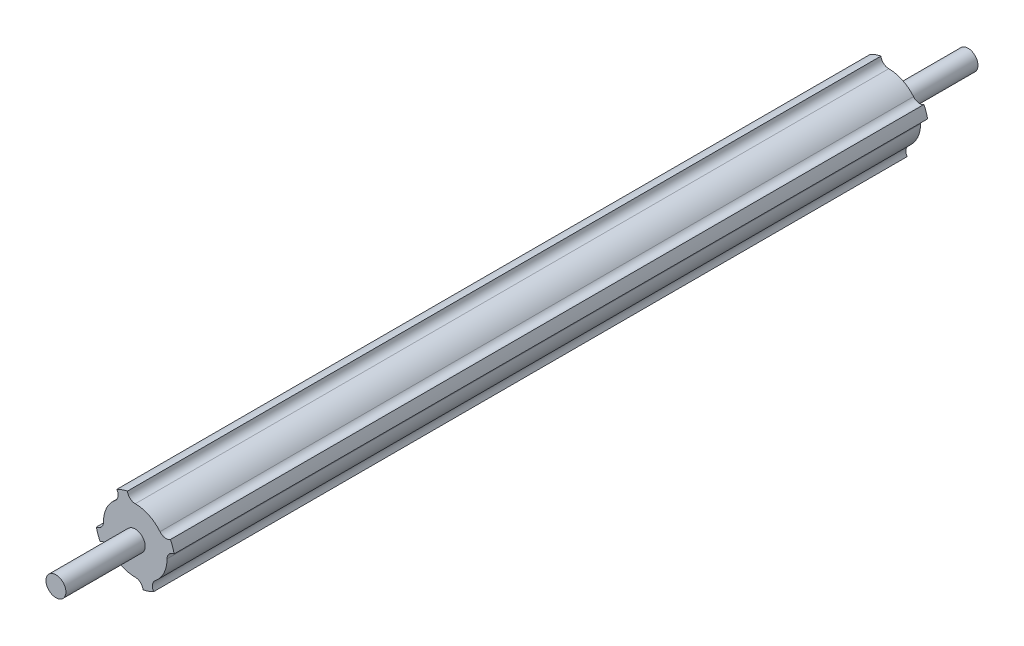
ISO-10303-21;
HEADER;
FILE_DESCRIPTION(('STEP AP214'),'2;1');
FILE_NAME('part.step','',(''),(''),'','','');
FILE_SCHEMA(('AUTOMOTIVE_DESIGN { 1 0 10303 214 1 1 1 1 }'));
ENDSEC;
DATA;
#1=APPLICATION_CONTEXT('core data for automotive mechanical design processes');
#2=APPLICATION_PROTOCOL_DEFINITION('international standard','automotive_design',2000,#1);
#3=PRODUCT_CONTEXT('',#1,'mechanical');
#4=PRODUCT('Part','Part','',(#3));
#5=PRODUCT_RELATED_PRODUCT_CATEGORY('part','',(#4));
#6=PRODUCT_DEFINITION_FORMATION('','',#4);
#7=PRODUCT_DEFINITION_CONTEXT('part definition',#1,'design');
#8=PRODUCT_DEFINITION('design','',#6,#7);
#9=PRODUCT_DEFINITION_SHAPE('','',#8);
#10=(LENGTH_UNIT() NAMED_UNIT(*) SI_UNIT(.MILLI.,.METRE.));
#11=(NAMED_UNIT(*) PLANE_ANGLE_UNIT() SI_UNIT($,.RADIAN.));
#12=(NAMED_UNIT(*) SI_UNIT($,.STERADIAN.) SOLID_ANGLE_UNIT());
#13=UNCERTAINTY_MEASURE_WITH_UNIT(LENGTH_MEASURE(1.E-05),#10,'distance_accuracy_value','');
#14=(GEOMETRIC_REPRESENTATION_CONTEXT(3) GLOBAL_UNCERTAINTY_ASSIGNED_CONTEXT((#13)) GLOBAL_UNIT_ASSIGNED_CONTEXT((#10,
#11,#12)) REPRESENTATION_CONTEXT('',''));
#15=CARTESIAN_POINT('',(0.,0.,0.));
#16=DIRECTION('',(0.,0.,1.));
#17=DIRECTION('',(1.,0.,0.));
#18=AXIS2_PLACEMENT_3D('',#15,#16,#17);
#19=CARTESIAN_POINT('',(0.,0.,584.2));
#20=DIRECTION('',(0.,0.,-1.));
#21=DIRECTION('',(-1.,0.,0.));
#22=AXIS2_PLACEMENT_3D('',#19,#20,#21);
#23=CYLINDRICAL_SURFACE('',#22,25.4);
#24=CARTESIAN_POINT('',(0.,0.,50.8));
#25=DIRECTION('',(0.,0.,1.));
#26=DIRECTION('',(1.,0.,0.));
#27=AXIS2_PLACEMENT_3D('',#24,#25,#26);
#28=CIRCLE('',#27,25.4);
#29=CARTESIAN_POINT('',(-4.99077597716393,24.9048620784329,50.8));
#30=VERTEX_POINT('',#29);
#31=CARTESIAN_POINT('',(-11.781548987493,22.5023355111265,50.8));
#32=VERTEX_POINT('',#31);
#33=EDGE_CURVE('E266',#30,#32,#28,.T.);
#34=ORIENTED_EDGE('',*,*,#33,.T.);
#35=DIRECTION('',(0.,0.,1.));
#36=VECTOR('',#35,1.);
#37=CARTESIAN_POINT('',(-11.781548987493,22.5023355111265,292.1));
#38=LINE('',#37,#36);
#39=CARTESIAN_POINT('',(-11.781548987493,22.5023355111265,533.4));
#40=VERTEX_POINT('',#39);
#41=EDGE_CURVE('E174',#32,#40,#38,.T.);
#42=ORIENTED_EDGE('',*,*,#41,.T.);
#43=CARTESIAN_POINT('',(0.,0.,533.4));
#44=DIRECTION('',(0.,0.,1.));
#45=DIRECTION('',(1.,0.,0.));
#46=AXIS2_PLACEMENT_3D('',#43,#44,#45);
#47=CIRCLE('',#46,25.4);
#48=CARTESIAN_POINT('',(-4.99077597716394,24.9048620784329,533.4));
#49=VERTEX_POINT('',#48);
#50=EDGE_CURVE('E265',#49,#40,#47,.T.);
#51=ORIENTED_EDGE('',*,*,#50,.F.);
#52=DIRECTION('',(0.,0.,1.));
#53=VECTOR('',#52,1.);
#54=CARTESIAN_POINT('',(-4.99077597716393,24.9048620784329,316.230000000001));
#55=LINE('',#54,#53);
#56=EDGE_CURVE('E234',#49,#30,#55,.F.);
#57=ORIENTED_EDGE('',*,*,#56,.T.);
#58=EDGE_LOOP('',(#34,#42,#51,#57));
#59=FACE_BOUND('',#58,.T.);
#60=ADVANCED_FACE('F51',(#59),#23,.T.);
#61=CARTESIAN_POINT('',(-24.9048620784329,-4.99077597716368,533.4));
#62=VERTEX_POINT('',#61);
#63=CARTESIAN_POINT('',(-22.5023355111263,-11.7815489874932,533.4));
#64=VERTEX_POINT('',#63);
#65=EDGE_CURVE('E272',#62,#64,#47,.T.);
#66=ORIENTED_EDGE('',*,*,#65,.F.);
#67=DIRECTION('',(0.,0.,1.));
#68=VECTOR('',#67,1.);
#69=CARTESIAN_POINT('',(-24.9048620784329,-4.99077597716367,292.1));
#70=LINE('',#69,#68);
#71=CARTESIAN_POINT('',(-24.9048620784329,-4.99077597716367,50.8));
#72=VERTEX_POINT('',#71);
#73=EDGE_CURVE('E66',#62,#72,#70,.F.);
#74=ORIENTED_EDGE('',*,*,#73,.T.);
#75=CARTESIAN_POINT('',(-22.5023355111263,-11.7815489874932,50.8));
#76=VERTEX_POINT('',#75);
#77=EDGE_CURVE('E183',#72,#76,#28,.T.);
#78=ORIENTED_EDGE('',*,*,#77,.T.);
#79=DIRECTION('',(0.,0.,1.));
#80=VECTOR('',#79,1.);
#81=CARTESIAN_POINT('',(-22.5023355111263,-11.7815489874932,292.1));
#82=LINE('',#81,#80);
#83=EDGE_CURVE('E204',#76,#64,#82,.T.);
#84=ORIENTED_EDGE('',*,*,#83,.T.);
#85=EDGE_LOOP('',(#66,#74,#78,#84));
#86=FACE_BOUND('',#85,.T.);
#87=ADVANCED_FACE('F326',(#86),#23,.T.);
#88=CARTESIAN_POINT('',(4.99077597716394,-24.9048620784329,533.4));
#89=VERTEX_POINT('',#88);
#90=CARTESIAN_POINT('',(11.7815489874931,-22.5023355111264,533.4));
#91=VERTEX_POINT('',#90);
#92=EDGE_CURVE('E338',#89,#91,#47,.T.);
#93=ORIENTED_EDGE('',*,*,#92,.F.);
#94=DIRECTION('',(0.,0.,1.));
#95=VECTOR('',#94,1.);
#96=CARTESIAN_POINT('',(4.99077597716393,-24.9048620784329,292.1));
#97=LINE('',#96,#95);
#98=CARTESIAN_POINT('',(4.99077597716393,-24.9048620784329,50.8));
#99=VERTEX_POINT('',#98);
#100=EDGE_CURVE('E74',#89,#99,#97,.F.);
#101=ORIENTED_EDGE('',*,*,#100,.T.);
#102=CARTESIAN_POINT('',(11.7815489874932,-22.5023355111264,50.8));
#103=VERTEX_POINT('',#102);
#104=EDGE_CURVE('E319',#99,#103,#28,.T.);
#105=ORIENTED_EDGE('',*,*,#104,.T.);
#106=DIRECTION('',(0.,0.,1.));
#107=VECTOR('',#106,1.);
#108=CARTESIAN_POINT('',(11.7815489874932,-22.5023355111264,292.1));
#109=LINE('',#108,#107);
#110=EDGE_CURVE('E224',#103,#91,#109,.T.);
#111=ORIENTED_EDGE('',*,*,#110,.T.);
#112=EDGE_LOOP('',(#93,#101,#105,#111));
#113=FACE_BOUND('',#112,.T.);
#114=ADVANCED_FACE('F339',(#113),#23,.T.);
#115=CARTESIAN_POINT('',(24.9048620784329,4.99077597716385,533.4));
#116=VERTEX_POINT('',#115);
#117=CARTESIAN_POINT('',(22.5023355111263,11.7815489874932,533.4));
#118=VERTEX_POINT('',#117);
#119=EDGE_CURVE('E255',#116,#118,#47,.T.);
#120=ORIENTED_EDGE('',*,*,#119,.F.);
#121=DIRECTION('',(0.,0.,1.));
#122=VECTOR('',#121,1.);
#123=CARTESIAN_POINT('',(24.9048620784329,4.99077597716385,292.1));
#124=LINE('',#123,#122);
#125=CARTESIAN_POINT('',(24.9048620784329,4.99077597716385,50.8));
#126=VERTEX_POINT('',#125);
#127=EDGE_CURVE('E213',#116,#126,#124,.F.);
#128=ORIENTED_EDGE('',*,*,#127,.T.);
#129=CARTESIAN_POINT('',(22.5023355111263,11.7815489874932,50.8));
#130=VERTEX_POINT('',#129);
#131=EDGE_CURVE('E261',#126,#130,#28,.T.);
#132=ORIENTED_EDGE('',*,*,#131,.T.);
#133=DIRECTION('',(0.,0.,1.));
#134=VECTOR('',#133,1.);
#135=CARTESIAN_POINT('',(22.5023355111263,11.7815489874932,316.230000000001));
#136=LINE('',#135,#134);
#137=EDGE_CURVE('E245',#130,#118,#136,.T.);
#138=ORIENTED_EDGE('',*,*,#137,.T.);
#139=EDGE_LOOP('',(#120,#128,#132,#138));
#140=FACE_BOUND('',#139,.T.);
#141=ADVANCED_FACE('F53',(#140),#23,.T.);
#142=CARTESIAN_POINT('',(0.,0.,50.8));
#143=DIRECTION('',(0.,0.,1.));
#144=DIRECTION('',(1.,0.,0.));
#145=AXIS2_PLACEMENT_3D('',#142,#143,#144);
#146=PLANE('',#145);
#147=CARTESIAN_POINT('',(0.,0.,50.8));
#148=DIRECTION('',(0.,0.,1.));
#149=DIRECTION('',(1.,0.,0.));
#150=AXIS2_PLACEMENT_3D('',#147,#148,#149);
#151=CIRCLE('',#150,6.36193552466987);
#152=CARTESIAN_POINT('',(6.36193552466987,0.,50.8));
#153=VERTEX_POINT('',#152);
#154=EDGE_CURVE('E258',#153,#153,#151,.T.);
#155=ORIENTED_EDGE('',*,*,#154,.T.);
#156=EDGE_LOOP('',(#155));
#157=FACE_BOUND('',#156,.T.);
#158=CARTESIAN_POINT('',(0.,0.,50.8));
#159=DIRECTION('',(0.,0.,1.));
#160=DIRECTION('',(1.,0.,0.));
#161=AXIS2_PLACEMENT_3D('',#158,#159,#160);
#162=CIRCLE('',#161,20.3847226980345);
#163=CARTESIAN_POINT('',(-20.3847226980345,2.15417311681383E-13,50.8));
#164=VERTEX_POINT('',#163);
#165=CARTESIAN_POINT('',(-12.8193468477229,15.8493301395844,50.8));
#166=VERTEX_POINT('',#165);
#167=EDGE_CURVE('E164',#164,#166,#162,.F.);
#168=ORIENTED_EDGE('',*,*,#167,.T.);
#169=CARTESIAN_POINT('',(-15.9733058308199,19.748759475853,50.8));
#170=DIRECTION('',(0.,0.,1.));
#171=DIRECTION('',(1.,0.,0.));
#172=AXIS2_PLACEMENT_3D('',#169,#170,#171);
#173=CIRCLE('',#172,5.01527730196551);
#174=EDGE_CURVE('E189',#166,#32,#173,.T.);
#175=ORIENTED_EDGE('',*,*,#174,.T.);
#176=ORIENTED_EDGE('',*,*,#33,.F.);
#177=CARTESIAN_POINT('',(0.,25.4,50.8));
#178=DIRECTION('',(0.,0.,1.));
#179=DIRECTION('',(1.,0.,0.));
#180=AXIS2_PLACEMENT_3D('',#177,#178,#179);
#181=CIRCLE('',#180,5.01527730196551);
#182=CARTESIAN_POINT('',(0.,20.3847226980345,50.8));
#183=VERTEX_POINT('',#182);
#184=EDGE_CURVE('E239',#30,#183,#181,.T.);
#185=ORIENTED_EDGE('',*,*,#184,.T.);
#186=CARTESIAN_POINT('',(0.,0.,50.8));
#187=DIRECTION('',(0.,0.,1.));
#188=DIRECTION('',(1.,0.,0.));
#189=AXIS2_PLACEMENT_3D('',#186,#187,#188);
#190=CIRCLE('',#189,20.3847226980345);
#191=CARTESIAN_POINT('',(15.8493301395843,12.8193468477231,50.8));
#192=VERTEX_POINT('',#191);
#193=EDGE_CURVE('E242',#183,#192,#190,.F.);
#194=ORIENTED_EDGE('',*,*,#193,.T.);
#195=CARTESIAN_POINT('',(19.7487594758528,15.9733058308201,50.8));
#196=DIRECTION('',(0.,0.,1.));
#197=DIRECTION('',(1.,0.,0.));
#198=AXIS2_PLACEMENT_3D('',#195,#196,#197);
#199=CIRCLE('',#198,5.01527730196551);
#200=EDGE_CURVE('E248',#192,#130,#199,.T.);
#201=ORIENTED_EDGE('',*,*,#200,.T.);
#202=ORIENTED_EDGE('',*,*,#131,.F.);
#203=CARTESIAN_POINT('',(25.4,0.,50.8));
#204=DIRECTION('',(0.,0.,1.));
#205=DIRECTION('',(1.,0.,0.));
#206=AXIS2_PLACEMENT_3D('',#203,#204,#205);
#207=CIRCLE('',#206,5.01527730196551);
#208=CARTESIAN_POINT('',(20.3847226980345,0.,50.8));
#209=VERTEX_POINT('',#208);
#210=EDGE_CURVE('E218',#126,#209,#207,.T.);
#211=ORIENTED_EDGE('',*,*,#210,.T.);
#212=CARTESIAN_POINT('',(0.,0.,50.8));
#213=DIRECTION('',(0.,0.,1.));
#214=DIRECTION('',(1.,0.,0.));
#215=AXIS2_PLACEMENT_3D('',#212,#213,#214);
#216=CIRCLE('',#215,20.3847226980345);
#217=CARTESIAN_POINT('',(12.819346847723,-15.8493301395843,50.8));
#218=VERTEX_POINT('',#217);
#219=EDGE_CURVE('E221',#209,#218,#216,.F.);
#220=ORIENTED_EDGE('',*,*,#219,.T.);
#221=CARTESIAN_POINT('',(15.9733058308201,-19.7487594758529,50.8));
#222=DIRECTION('',(0.,0.,1.));
#223=DIRECTION('',(1.,0.,0.));
#224=AXIS2_PLACEMENT_3D('',#221,#222,#223);
#225=CIRCLE('',#224,5.01527730196551);
#226=EDGE_CURVE('E227',#218,#103,#225,.T.);
#227=ORIENTED_EDGE('',*,*,#226,.T.);
#228=ORIENTED_EDGE('',*,*,#104,.F.);
#229=CARTESIAN_POINT('',(0.,-25.4,50.8));
#230=DIRECTION('',(0.,0.,1.));
#231=DIRECTION('',(1.,0.,0.));
#232=AXIS2_PLACEMENT_3D('',#229,#230,#231);
#233=CIRCLE('',#232,5.01527730196551);
#234=CARTESIAN_POINT('',(0.,-20.3847226980345,50.8));
#235=VERTEX_POINT('',#234);
#236=EDGE_CURVE('E198',#99,#235,#233,.T.);
#237=ORIENTED_EDGE('',*,*,#236,.T.);
#238=CARTESIAN_POINT('',(0.,0.,50.8));
#239=DIRECTION('',(0.,0.,1.));
#240=DIRECTION('',(1.,0.,0.));
#241=AXIS2_PLACEMENT_3D('',#238,#239,#240);
#242=CIRCLE('',#241,20.3847226980345);
#243=CARTESIAN_POINT('',(-15.8493301395843,-12.8193468477231,50.8));
#244=VERTEX_POINT('',#243);
#245=EDGE_CURVE('E201',#235,#244,#242,.F.);
#246=ORIENTED_EDGE('',*,*,#245,.T.);
#247=CARTESIAN_POINT('',(-19.7487594758528,-15.9733058308201,50.8));
#248=DIRECTION('',(0.,0.,1.));
#249=DIRECTION('',(1.,0.,0.));
#250=AXIS2_PLACEMENT_3D('',#247,#248,#249);
#251=CIRCLE('',#250,5.01527730196551);
#252=EDGE_CURVE('E207',#244,#76,#251,.T.);
#253=ORIENTED_EDGE('',*,*,#252,.T.);
#254=ORIENTED_EDGE('',*,*,#77,.F.);
#255=CARTESIAN_POINT('',(-25.4,2.68870844502395E-13,50.8));
#256=DIRECTION('',(0.,0.,1.));
#257=DIRECTION('',(1.,0.,0.));
#258=AXIS2_PLACEMENT_3D('',#255,#256,#257);
#259=CIRCLE('',#258,5.01527730196551);
#260=EDGE_CURVE('E175',#72,#164,#259,.T.);
#261=ORIENTED_EDGE('',*,*,#260,.T.);
#262=EDGE_LOOP('',(#168,#175,#176,#185,#194,#201,#202,#211,#220,#227,#228,#237,#246,#253,#254,#261));
#263=FACE_BOUND('',#262,.T.);
#264=ADVANCED_FACE('F181',(#157,#263),#146,.F.);
#265=CARTESIAN_POINT('',(0.,0.,50.8));
#266=DIRECTION('',(0.,0.,-1.));
#267=DIRECTION('',(-1.,0.,0.));
#268=AXIS2_PLACEMENT_3D('',#265,#266,#267);
#269=CYLINDRICAL_SURFACE('',#268,6.36193552466987);
#270=ORIENTED_EDGE('',*,*,#154,.F.);
#271=EDGE_LOOP('',(#270));
#272=FACE_BOUND('',#271,.T.);
#273=CARTESIAN_POINT('',(0.,0.,0.));
#274=DIRECTION('',(0.,0.,1.));
#275=DIRECTION('',(1.,0.,0.));
#276=AXIS2_PLACEMENT_3D('',#273,#274,#275);
#277=CIRCLE('',#276,6.36193552466987);
#278=CARTESIAN_POINT('',(6.36193552466987,0.,0.));
#279=VERTEX_POINT('',#278);
#280=EDGE_CURVE('E262',#279,#279,#277,.T.);
#281=ORIENTED_EDGE('',*,*,#280,.T.);
#282=EDGE_LOOP('',(#281));
#283=FACE_BOUND('',#282,.T.);
#284=ADVANCED_FACE('F367',(#272,#283),#269,.T.);
#285=CARTESIAN_POINT('',(0.,0.,0.));
#286=DIRECTION('',(0.,0.,1.));
#287=DIRECTION('',(1.,0.,0.));
#288=AXIS2_PLACEMENT_3D('',#285,#286,#287);
#289=PLANE('',#288);
#290=ORIENTED_EDGE('',*,*,#280,.F.);
#291=EDGE_LOOP('',(#290));
#292=FACE_BOUND('',#291,.T.);
#293=ADVANCED_FACE('F435',(#292),#289,.F.);
#294=CARTESIAN_POINT('',(0.,0.,533.4));
#295=DIRECTION('',(0.,0.,1.));
#296=DIRECTION('',(1.,0.,0.));
#297=AXIS2_PLACEMENT_3D('',#294,#295,#296);
#298=PLANE('',#297);
#299=CARTESIAN_POINT('',(-15.9733058308199,19.748759475853,533.4));
#300=DIRECTION('',(0.,0.,1.));
#301=DIRECTION('',(1.,0.,0.));
#302=AXIS2_PLACEMENT_3D('',#299,#300,#301);
#303=CIRCLE('',#302,5.01527730196551);
#304=CARTESIAN_POINT('',(-12.8193468477229,15.8493301395844,533.4));
#305=VERTEX_POINT('',#304);
#306=EDGE_CURVE('E13',#305,#40,#303,.T.);
#307=ORIENTED_EDGE('',*,*,#306,.F.);
#308=CARTESIAN_POINT('',(0.,0.,533.4));
#309=DIRECTION('',(0.,0.,1.));
#310=DIRECTION('',(1.,0.,0.));
#311=AXIS2_PLACEMENT_3D('',#308,#309,#310);
#312=CIRCLE('',#311,20.3847226980345);
#313=CARTESIAN_POINT('',(-20.3847226980345,2.15417311681383E-13,533.4));
#314=VERTEX_POINT('',#313);
#315=EDGE_CURVE('E59',#314,#305,#312,.F.);
#316=ORIENTED_EDGE('',*,*,#315,.F.);
#317=CARTESIAN_POINT('',(-25.4,2.68870844502395E-13,533.4));
#318=DIRECTION('',(0.,0.,1.));
#319=DIRECTION('',(1.,0.,0.));
#320=AXIS2_PLACEMENT_3D('',#317,#318,#319);
#321=CIRCLE('',#320,5.01527730196551);
#322=EDGE_CURVE('E178',#62,#314,#321,.T.);
#323=ORIENTED_EDGE('',*,*,#322,.F.);
#324=ORIENTED_EDGE('',*,*,#65,.T.);
#325=CARTESIAN_POINT('',(-19.7487594758528,-15.9733058308201,533.4));
#326=DIRECTION('',(0.,0.,1.));
#327=DIRECTION('',(1.,0.,0.));
#328=AXIS2_PLACEMENT_3D('',#325,#326,#327);
#329=CIRCLE('',#328,5.01527730196551);
#330=CARTESIAN_POINT('',(-15.8493301395843,-12.8193468477231,533.4));
#331=VERTEX_POINT('',#330);
#332=EDGE_CURVE('E290',#331,#64,#329,.T.);
#333=ORIENTED_EDGE('',*,*,#332,.F.);
#334=CARTESIAN_POINT('',(0.,0.,533.4));
#335=DIRECTION('',(0.,0.,1.));
#336=DIRECTION('',(1.,0.,0.));
#337=AXIS2_PLACEMENT_3D('',#334,#335,#336);
#338=CIRCLE('',#337,20.3847226980345);
#339=CARTESIAN_POINT('',(0.,-20.3847226980345,533.4));
#340=VERTEX_POINT('',#339);
#341=EDGE_CURVE('E288',#340,#331,#338,.F.);
#342=ORIENTED_EDGE('',*,*,#341,.F.);
#343=CARTESIAN_POINT('',(0.,-25.4,533.4));
#344=DIRECTION('',(0.,0.,1.));
#345=DIRECTION('',(1.,0.,0.));
#346=AXIS2_PLACEMENT_3D('',#343,#344,#345);
#347=CIRCLE('',#346,5.01527730196551);
#348=EDGE_CURVE('E286',#89,#340,#347,.T.);
#349=ORIENTED_EDGE('',*,*,#348,.F.);
#350=ORIENTED_EDGE('',*,*,#92,.T.);
#351=CARTESIAN_POINT('',(15.9733058308201,-19.7487594758529,533.4));
#352=DIRECTION('',(0.,0.,1.));
#353=DIRECTION('',(1.,0.,0.));
#354=AXIS2_PLACEMENT_3D('',#351,#352,#353);
#355=CIRCLE('',#354,5.01527730196551);
#356=CARTESIAN_POINT('',(12.819346847723,-15.8493301395843,533.4));
#357=VERTEX_POINT('',#356);
#358=EDGE_CURVE('E283',#357,#91,#355,.T.);
#359=ORIENTED_EDGE('',*,*,#358,.F.);
#360=CARTESIAN_POINT('',(0.,0.,533.4));
#361=DIRECTION('',(0.,0.,1.));
#362=DIRECTION('',(1.,0.,0.));
#363=AXIS2_PLACEMENT_3D('',#360,#361,#362);
#364=CIRCLE('',#363,20.3847226980345);
#365=CARTESIAN_POINT('',(20.3847226980345,0.,533.4));
#366=VERTEX_POINT('',#365);
#367=EDGE_CURVE('E281',#366,#357,#364,.F.);
#368=ORIENTED_EDGE('',*,*,#367,.F.);
#369=CARTESIAN_POINT('',(25.4,0.,533.4));
#370=DIRECTION('',(0.,0.,1.));
#371=DIRECTION('',(1.,0.,0.));
#372=AXIS2_PLACEMENT_3D('',#369,#370,#371);
#373=CIRCLE('',#372,5.01527730196551);
#374=EDGE_CURVE('E279',#116,#366,#373,.T.);
#375=ORIENTED_EDGE('',*,*,#374,.F.);
#376=ORIENTED_EDGE('',*,*,#119,.T.);
#377=CARTESIAN_POINT('',(19.7487594758528,15.9733058308201,533.4));
#378=DIRECTION('',(0.,0.,1.));
#379=DIRECTION('',(1.,0.,0.));
#380=AXIS2_PLACEMENT_3D('',#377,#378,#379);
#381=CIRCLE('',#380,5.01527730196551);
#382=CARTESIAN_POINT('',(15.8493301395843,12.8193468477231,533.4));
#383=VERTEX_POINT('',#382);
#384=EDGE_CURVE('E276',#383,#118,#381,.T.);
#385=ORIENTED_EDGE('',*,*,#384,.F.);
#386=CARTESIAN_POINT('',(0.,0.,533.4));
#387=DIRECTION('',(0.,0.,1.));
#388=DIRECTION('',(1.,0.,0.));
#389=AXIS2_PLACEMENT_3D('',#386,#387,#388);
#390=CIRCLE('',#389,20.3847226980345);
#391=CARTESIAN_POINT('',(0.,20.3847226980345,533.4));
#392=VERTEX_POINT('',#391);
#393=EDGE_CURVE('E274',#392,#383,#390,.F.);
#394=ORIENTED_EDGE('',*,*,#393,.F.);
#395=CARTESIAN_POINT('',(0.,25.4,533.4));
#396=DIRECTION('',(0.,0.,1.));
#397=DIRECTION('',(1.,0.,0.));
#398=AXIS2_PLACEMENT_3D('',#395,#396,#397);
#399=CIRCLE('',#398,5.01527730196551);
#400=EDGE_CURVE('E269',#49,#392,#399,.T.);
#401=ORIENTED_EDGE('',*,*,#400,.F.);
#402=ORIENTED_EDGE('',*,*,#50,.T.);
#403=EDGE_LOOP('',(#307,#316,#323,#324,#333,#342,#349,#350,#359,#368,#375,#376,#385,#394,#401,#402));
#404=FACE_BOUND('',#403,.T.);
#405=CARTESIAN_POINT('',(0.,0.,533.4));
#406=DIRECTION('',(0.,0.,1.));
#407=DIRECTION('',(1.,0.,0.));
#408=AXIS2_PLACEMENT_3D('',#405,#406,#407);
#409=CIRCLE('',#408,6.37790763137687);
#410=CARTESIAN_POINT('',(6.37790763137687,0.,533.4));
#411=VERTEX_POINT('',#410);
#412=EDGE_CURVE('E252',#411,#411,#409,.T.);
#413=ORIENTED_EDGE('',*,*,#412,.F.);
#414=EDGE_LOOP('',(#413));
#415=FACE_BOUND('',#414,.T.);
#416=ADVANCED_FACE('F298',(#404,#415),#298,.T.);
#417=CARTESIAN_POINT('',(0.,0.,533.4));
#418=DIRECTION('',(0.,0.,1.));
#419=DIRECTION('',(1.,0.,0.));
#420=AXIS2_PLACEMENT_3D('',#417,#418,#419);
#421=CYLINDRICAL_SURFACE('',#420,6.37790763137687);
#422=ORIENTED_EDGE('',*,*,#412,.T.);
#423=EDGE_LOOP('',(#422));
#424=FACE_BOUND('',#423,.T.);
#425=CARTESIAN_POINT('',(0.,0.,584.2));
#426=DIRECTION('',(0.,0.,1.));
#427=DIRECTION('',(1.,0.,0.));
#428=AXIS2_PLACEMENT_3D('',#425,#426,#427);
#429=CIRCLE('',#428,6.37790763137687);
#430=CARTESIAN_POINT('',(6.37790763137687,0.,584.2));
#431=VERTEX_POINT('',#430);
#432=EDGE_CURVE('E251',#431,#431,#429,.T.);
#433=ORIENTED_EDGE('',*,*,#432,.F.);
#434=EDGE_LOOP('',(#433));
#435=FACE_BOUND('',#434,.T.);
#436=ADVANCED_FACE('F417',(#424,#435),#421,.T.);
#437=CARTESIAN_POINT('',(0.,0.,584.2));
#438=DIRECTION('',(0.,0.,1.));
#439=DIRECTION('',(1.,0.,0.));
#440=AXIS2_PLACEMENT_3D('',#437,#438,#439);
#441=PLANE('',#440);
#442=ORIENTED_EDGE('',*,*,#432,.T.);
#443=EDGE_LOOP('',(#442));
#444=FACE_BOUND('',#443,.T.);
#445=ADVANCED_FACE('F407',(#444),#441,.T.);
#446=CARTESIAN_POINT('',(19.7487594758528,15.9733058308201,48.2600000000021));
#447=DIRECTION('',(0.,0.,1.));
#448=DIRECTION('',(1.,0.,0.));
#449=AXIS2_PLACEMENT_3D('',#446,#447,#448);
#450=CYLINDRICAL_SURFACE('',#449,5.01527730196551);
#451=DIRECTION('',(0.,0.,1.));
#452=VECTOR('',#451,1.);
#453=CARTESIAN_POINT('',(15.8493301395843,12.8193468477231,48.2600000000021));
#454=LINE('',#453,#452);
#455=EDGE_CURVE('E231',#192,#383,#454,.T.);
#456=ORIENTED_EDGE('',*,*,#455,.T.);
#457=ORIENTED_EDGE('',*,*,#384,.T.);
#458=ORIENTED_EDGE('',*,*,#137,.F.);
#459=ORIENTED_EDGE('',*,*,#200,.F.);
#460=EDGE_LOOP('',(#456,#457,#458,#459));
#461=FACE_BOUND('',#460,.T.);
#462=ADVANCED_FACE('F316',(#461),#450,.F.);
#463=CARTESIAN_POINT('',(0.,0.,48.2600000000021));
#464=DIRECTION('',(0.,0.,1.));
#465=DIRECTION('',(1.,0.,0.));
#466=AXIS2_PLACEMENT_3D('',#463,#464,#465);
#467=CYLINDRICAL_SURFACE('',#466,20.3847226980345);
#468=DIRECTION('',(0.,0.,1.));
#469=VECTOR('',#468,1.);
#470=CARTESIAN_POINT('',(0.,20.3847226980345,48.2600000000021));
#471=LINE('',#470,#469);
#472=EDGE_CURVE('E230',#183,#392,#471,.T.);
#473=ORIENTED_EDGE('',*,*,#472,.T.);
#474=ORIENTED_EDGE('',*,*,#393,.T.);
#475=ORIENTED_EDGE('',*,*,#455,.F.);
#476=ORIENTED_EDGE('',*,*,#193,.F.);
#477=EDGE_LOOP('',(#473,#474,#475,#476));
#478=FACE_BOUND('',#477,.T.);
#479=ADVANCED_FACE('F309',(#478),#467,.T.);
#480=CARTESIAN_POINT('',(0.,25.4,48.2600000000021));
#481=DIRECTION('',(0.,0.,1.));
#482=DIRECTION('',(1.,0.,0.));
#483=AXIS2_PLACEMENT_3D('',#480,#481,#482);
#484=CYLINDRICAL_SURFACE('',#483,5.01527730196551);
#485=ORIENTED_EDGE('',*,*,#56,.F.);
#486=ORIENTED_EDGE('',*,*,#400,.T.);
#487=ORIENTED_EDGE('',*,*,#472,.F.);
#488=ORIENTED_EDGE('',*,*,#184,.F.);
#489=EDGE_LOOP('',(#485,#486,#487,#488));
#490=FACE_BOUND('',#489,.T.);
#491=ADVANCED_FACE('F307',(#490),#484,.F.);
#492=CARTESIAN_POINT('',(15.9733058308201,-19.7487594758529,48.2600000000021));
#493=DIRECTION('',(0.,0.,1.));
#494=DIRECTION('',(1.,0.,0.));
#495=AXIS2_PLACEMENT_3D('',#492,#493,#494);
#496=CYLINDRICAL_SURFACE('',#495,5.01527730196551);
#497=DIRECTION('',(0.,0.,1.));
#498=VECTOR('',#497,1.);
#499=CARTESIAN_POINT('',(12.819346847723,-15.8493301395843,48.2600000000021));
#500=LINE('',#499,#498);
#501=EDGE_CURVE('E210',#218,#357,#500,.T.);
#502=ORIENTED_EDGE('',*,*,#501,.T.);
#503=ORIENTED_EDGE('',*,*,#358,.T.);
#504=ORIENTED_EDGE('',*,*,#110,.F.);
#505=ORIENTED_EDGE('',*,*,#226,.F.);
#506=EDGE_LOOP('',(#502,#503,#504,#505));
#507=FACE_BOUND('',#506,.T.);
#508=ADVANCED_FACE('F341',(#507),#496,.F.);
#509=CARTESIAN_POINT('',(0.,0.,48.2600000000021));
#510=DIRECTION('',(0.,0.,1.));
#511=DIRECTION('',(1.,0.,0.));
#512=AXIS2_PLACEMENT_3D('',#509,#510,#511);
#513=CYLINDRICAL_SURFACE('',#512,20.3847226980345);
#514=DIRECTION('',(0.,0.,1.));
#515=VECTOR('',#514,1.);
#516=CARTESIAN_POINT('',(20.3847226980345,0.,48.2600000000021));
#517=LINE('',#516,#515);
#518=EDGE_CURVE('E209',#209,#366,#517,.T.);
#519=ORIENTED_EDGE('',*,*,#518,.T.);
#520=ORIENTED_EDGE('',*,*,#367,.T.);
#521=ORIENTED_EDGE('',*,*,#501,.F.);
#522=ORIENTED_EDGE('',*,*,#219,.F.);
#523=EDGE_LOOP('',(#519,#520,#521,#522));
#524=FACE_BOUND('',#523,.T.);
#525=ADVANCED_FACE('F345',(#524),#513,.T.);
#526=CARTESIAN_POINT('',(25.4,0.,48.2600000000021));
#527=DIRECTION('',(0.,0.,1.));
#528=DIRECTION('',(1.,0.,0.));
#529=AXIS2_PLACEMENT_3D('',#526,#527,#528);
#530=CYLINDRICAL_SURFACE('',#529,5.01527730196551);
#531=ORIENTED_EDGE('',*,*,#127,.F.);
#532=ORIENTED_EDGE('',*,*,#374,.T.);
#533=ORIENTED_EDGE('',*,*,#518,.F.);
#534=ORIENTED_EDGE('',*,*,#210,.F.);
#535=EDGE_LOOP('',(#531,#532,#533,#534));
#536=FACE_BOUND('',#535,.T.);
#537=ADVANCED_FACE('F348',(#536),#530,.F.);
#538=CARTESIAN_POINT('',(-19.7487594758528,-15.9733058308201,48.2600000000021));
#539=DIRECTION('',(0.,0.,1.));
#540=DIRECTION('',(1.,0.,0.));
#541=AXIS2_PLACEMENT_3D('',#538,#539,#540);
#542=CYLINDRICAL_SURFACE('',#541,5.01527730196551);
#543=DIRECTION('',(0.,0.,1.));
#544=VECTOR('',#543,1.);
#545=CARTESIAN_POINT('',(-15.8493301395843,-12.8193468477231,48.2600000000021));
#546=LINE('',#545,#544);
#547=EDGE_CURVE('E192',#244,#331,#546,.T.);
#548=ORIENTED_EDGE('',*,*,#547,.T.);
#549=ORIENTED_EDGE('',*,*,#332,.T.);
#550=ORIENTED_EDGE('',*,*,#83,.F.);
#551=ORIENTED_EDGE('',*,*,#252,.F.);
#552=EDGE_LOOP('',(#548,#549,#550,#551));
#553=FACE_BOUND('',#552,.T.);
#554=ADVANCED_FACE('F328',(#553),#542,.F.);
#555=CARTESIAN_POINT('',(0.,0.,48.2600000000021));
#556=DIRECTION('',(0.,0.,1.));
#557=DIRECTION('',(1.,0.,0.));
#558=AXIS2_PLACEMENT_3D('',#555,#556,#557);
#559=CYLINDRICAL_SURFACE('',#558,20.3847226980345);
#560=DIRECTION('',(0.,0.,1.));
#561=VECTOR('',#560,1.);
#562=CARTESIAN_POINT('',(0.,-20.3847226980345,48.2600000000021));
#563=LINE('',#562,#561);
#564=EDGE_CURVE('E191',#235,#340,#563,.T.);
#565=ORIENTED_EDGE('',*,*,#564,.T.);
#566=ORIENTED_EDGE('',*,*,#341,.T.);
#567=ORIENTED_EDGE('',*,*,#547,.F.);
#568=ORIENTED_EDGE('',*,*,#245,.F.);
#569=EDGE_LOOP('',(#565,#566,#567,#568));
#570=FACE_BOUND('',#569,.T.);
#571=ADVANCED_FACE('F333',(#570),#559,.T.);
#572=CARTESIAN_POINT('',(0.,-25.4,48.2600000000021));
#573=DIRECTION('',(0.,0.,1.));
#574=DIRECTION('',(1.,0.,0.));
#575=AXIS2_PLACEMENT_3D('',#572,#573,#574);
#576=CYLINDRICAL_SURFACE('',#575,5.01527730196551);
#577=ORIENTED_EDGE('',*,*,#100,.F.);
#578=ORIENTED_EDGE('',*,*,#348,.T.);
#579=ORIENTED_EDGE('',*,*,#564,.F.);
#580=ORIENTED_EDGE('',*,*,#236,.F.);
#581=EDGE_LOOP('',(#577,#578,#579,#580));
#582=FACE_BOUND('',#581,.T.);
#583=ADVANCED_FACE('F335',(#582),#576,.F.);
#584=CARTESIAN_POINT('',(-15.9733058308199,19.748759475853,48.2600000000021));
#585=DIRECTION('',(0.,0.,1.));
#586=DIRECTION('',(1.,0.,0.));
#587=AXIS2_PLACEMENT_3D('',#584,#585,#586);
#588=CYLINDRICAL_SURFACE('',#587,5.01527730196551);
#589=DIRECTION('',(0.,0.,1.));
#590=VECTOR('',#589,1.);
#591=CARTESIAN_POINT('',(-12.8193468477229,15.8493301395844,48.2600000000021));
#592=LINE('',#591,#590);
#593=EDGE_CURVE('E170',#166,#305,#592,.T.);
#594=ORIENTED_EDGE('',*,*,#593,.T.);
#595=ORIENTED_EDGE('',*,*,#306,.T.);
#596=ORIENTED_EDGE('',*,*,#41,.F.);
#597=ORIENTED_EDGE('',*,*,#174,.F.);
#598=EDGE_LOOP('',(#594,#595,#596,#597));
#599=FACE_BOUND('',#598,.T.);
#600=ADVANCED_FACE('F296',(#599),#588,.F.);
#601=CARTESIAN_POINT('',(0.,0.,48.2600000000021));
#602=DIRECTION('',(0.,0.,1.));
#603=DIRECTION('',(1.,0.,0.));
#604=AXIS2_PLACEMENT_3D('',#601,#602,#603);
#605=CYLINDRICAL_SURFACE('',#604,20.3847226980345);
#606=DIRECTION('',(0.,0.,1.));
#607=VECTOR('',#606,1.);
#608=CARTESIAN_POINT('',(-20.3847226980345,2.15417311681383E-13,48.2600000000021));
#609=LINE('',#608,#607);
#610=EDGE_CURVE('E167',#164,#314,#609,.T.);
#611=ORIENTED_EDGE('',*,*,#610,.T.);
#612=ORIENTED_EDGE('',*,*,#315,.T.);
#613=ORIENTED_EDGE('',*,*,#593,.F.);
#614=ORIENTED_EDGE('',*,*,#167,.F.);
#615=EDGE_LOOP('',(#611,#612,#613,#614));
#616=FACE_BOUND('',#615,.T.);
#617=ADVANCED_FACE('F166',(#616),#605,.T.);
#618=CARTESIAN_POINT('',(-25.4,2.68870844502395E-13,48.2600000000021));
#619=DIRECTION('',(0.,0.,1.));
#620=DIRECTION('',(1.,0.,0.));
#621=AXIS2_PLACEMENT_3D('',#618,#619,#620);
#622=CYLINDRICAL_SURFACE('',#621,5.01527730196551);
#623=ORIENTED_EDGE('',*,*,#73,.F.);
#624=ORIENTED_EDGE('',*,*,#322,.T.);
#625=ORIENTED_EDGE('',*,*,#610,.F.);
#626=ORIENTED_EDGE('',*,*,#260,.F.);
#627=EDGE_LOOP('',(#623,#624,#625,#626));
#628=FACE_BOUND('',#627,.T.);
#629=ADVANCED_FACE('F177',(#628),#622,.F.);
#630=CLOSED_SHELL('',(#60,#87,#114,#141,#264,#284,#293,#416,#436,#445,#462,#479,#491,#508,#525,
#537,#554,#571,#583,#600,#617,#629));
#631=MANIFOLD_SOLID_BREP('B2',#630);
#632=ADVANCED_BREP_SHAPE_REPRESENTATION('',(#18,#631),#14);
#633=SHAPE_DEFINITION_REPRESENTATION(#9,#632);
ENDSEC;
END-ISO-10303-21;
